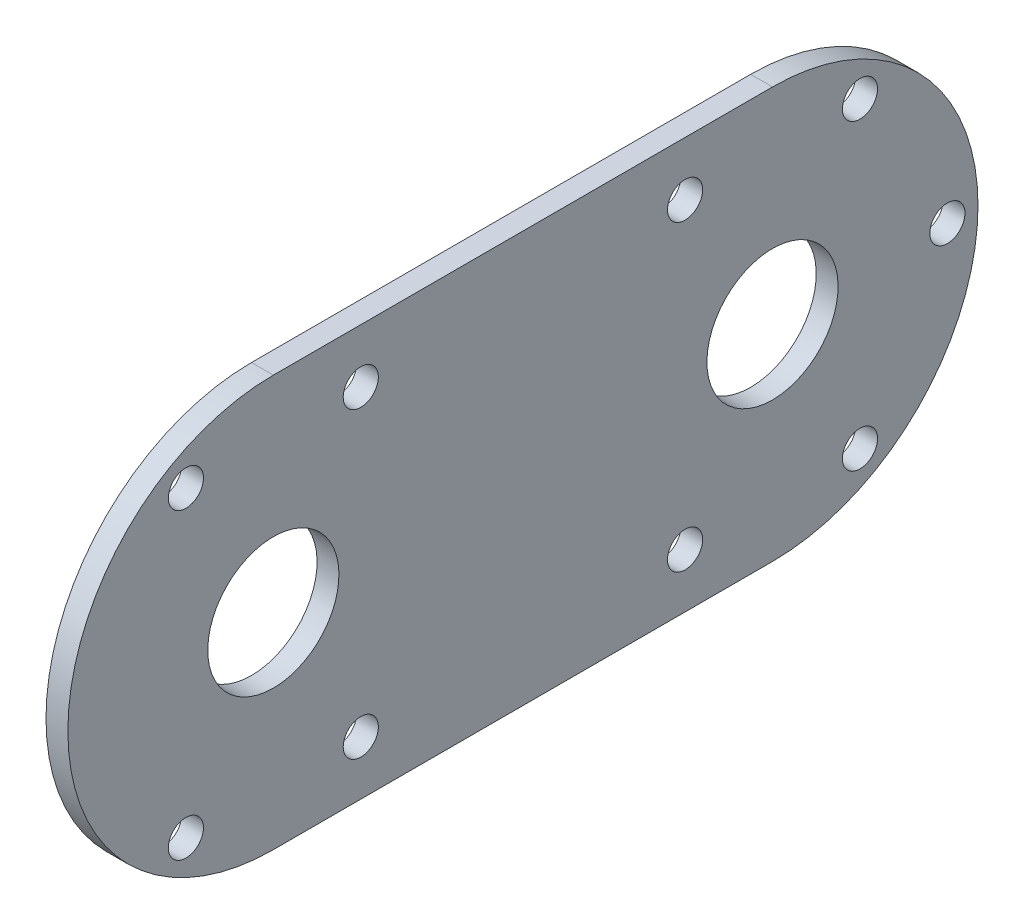
ISO-10303-21;
HEADER;
FILE_DESCRIPTION(('STEP AP214'),'2;1');
FILE_NAME('part.step','',(''),(''),'','','');
FILE_SCHEMA(('AUTOMOTIVE_DESIGN { 1 0 10303 214 1 1 1 1 }'));
ENDSEC;
DATA;
#1=APPLICATION_CONTEXT('core data for automotive mechanical design processes');
#2=APPLICATION_PROTOCOL_DEFINITION('international standard','automotive_design',2000,#1);
#3=PRODUCT_CONTEXT('',#1,'mechanical');
#4=PRODUCT('Part','Part','',(#3));
#5=PRODUCT_RELATED_PRODUCT_CATEGORY('part','',(#4));
#6=PRODUCT_DEFINITION_FORMATION('','',#4);
#7=PRODUCT_DEFINITION_CONTEXT('part definition',#1,'design');
#8=PRODUCT_DEFINITION('design','',#6,#7);
#9=PRODUCT_DEFINITION_SHAPE('','',#8);
#10=(LENGTH_UNIT() NAMED_UNIT(*) SI_UNIT(.MILLI.,.METRE.));
#11=(NAMED_UNIT(*) PLANE_ANGLE_UNIT() SI_UNIT($,.RADIAN.));
#12=(NAMED_UNIT(*) SI_UNIT($,.STERADIAN.) SOLID_ANGLE_UNIT());
#13=UNCERTAINTY_MEASURE_WITH_UNIT(LENGTH_MEASURE(1.E-05),#10,'distance_accuracy_value','');
#14=(GEOMETRIC_REPRESENTATION_CONTEXT(3) GLOBAL_UNCERTAINTY_ASSIGNED_CONTEXT((#13)) GLOBAL_UNIT_ASSIGNED_CONTEXT((#10,
#11,#12)) REPRESENTATION_CONTEXT('',''));
#15=CARTESIAN_POINT('',(0.,0.,0.));
#16=DIRECTION('',(0.,0.,1.));
#17=DIRECTION('',(1.,0.,0.));
#18=AXIS2_PLACEMENT_3D('',#15,#16,#17);
#19=CARTESIAN_POINT('',(282.575,301.6885,330.465339333629));
#20=DIRECTION('',(1.,0.,0.));
#21=DIRECTION('',(0.,1.,0.));
#22=AXIS2_PLACEMENT_3D('',#19,#20,#21);
#23=CYLINDRICAL_SURFACE('',#22,29.845);
#24=CARTESIAN_POINT('',(285.75,301.6885,330.465339333629));
#25=DIRECTION('',(-1.,0.,0.));
#26=DIRECTION('',(0.,-1.,0.));
#27=AXIS2_PLACEMENT_3D('',#24,#25,#26);
#28=CIRCLE('',#27,29.845);
#29=CARTESIAN_POINT('',(285.75,331.5335,330.465339333629));
#30=VERTEX_POINT('',#29);
#31=CARTESIAN_POINT('',(285.75,271.8435,330.465339333629));
#32=VERTEX_POINT('',#31);
#33=EDGE_CURVE('E73',#30,#32,#28,.T.);
#34=ORIENTED_EDGE('',*,*,#33,.T.);
#35=DIRECTION('',(1.,0.,0.));
#36=VECTOR('',#35,1.);
#37=CARTESIAN_POINT('',(282.575,271.8435,330.465339333629));
#38=LINE('',#37,#36);
#39=CARTESIAN_POINT('',(282.575,271.8435,330.465339333629));
#40=VERTEX_POINT('',#39);
#41=EDGE_CURVE('E11',#40,#32,#38,.T.);
#42=ORIENTED_EDGE('',*,*,#41,.F.);
#43=CARTESIAN_POINT('',(282.575,301.6885,330.465339333629));
#44=DIRECTION('',(-1.,0.,0.));
#45=DIRECTION('',(0.,-1.,0.));
#46=AXIS2_PLACEMENT_3D('',#43,#44,#45);
#47=CIRCLE('',#46,29.845);
#48=CARTESIAN_POINT('',(282.575,331.5335,330.465339333629));
#49=VERTEX_POINT('',#48);
#50=EDGE_CURVE('E69',#49,#40,#47,.T.);
#51=ORIENTED_EDGE('',*,*,#50,.F.);
#52=DIRECTION('',(1.,0.,0.));
#53=VECTOR('',#52,1.);
#54=CARTESIAN_POINT('',(282.575,331.5335,330.465339333629));
#55=LINE('',#54,#53);
#56=EDGE_CURVE('E35',#49,#30,#55,.T.);
#57=ORIENTED_EDGE('',*,*,#56,.T.);
#58=EDGE_LOOP('',(#34,#42,#51,#57));
#59=FACE_BOUND('',#58,.T.);
#60=ADVANCED_FACE('F17',(#59),#23,.T.);
#61=CARTESIAN_POINT('',(282.575,271.8435,366.715339333629));
#62=DIRECTION('',(0.,1.,0.));
#63=DIRECTION('',(0.,0.,1.));
#64=AXIS2_PLACEMENT_3D('',#61,#62,#63);
#65=PLANE('',#64);
#66=DIRECTION('',(0.,0.,1.));
#67=VECTOR('',#66,1.);
#68=CARTESIAN_POINT('',(285.75,271.8435,366.715339333629));
#69=LINE('',#68,#67);
#70=CARTESIAN_POINT('',(285.75,271.8435,402.965339333629));
#71=VERTEX_POINT('',#70);
#72=EDGE_CURVE('E76',#32,#71,#69,.T.);
#73=ORIENTED_EDGE('',*,*,#72,.T.);
#74=DIRECTION('',(1.,0.,0.));
#75=VECTOR('',#74,1.);
#76=CARTESIAN_POINT('',(282.575,271.8435,402.965339333629));
#77=LINE('',#76,#75);
#78=CARTESIAN_POINT('',(282.575,271.8435,402.965339333629));
#79=VERTEX_POINT('',#78);
#80=EDGE_CURVE('E27',#79,#71,#77,.T.);
#81=ORIENTED_EDGE('',*,*,#80,.F.);
#82=DIRECTION('',(0.,0.,1.));
#83=VECTOR('',#82,1.);
#84=CARTESIAN_POINT('',(282.575,271.8435,366.715339333629));
#85=LINE('',#84,#83);
#86=EDGE_CURVE('E61',#40,#79,#85,.T.);
#87=ORIENTED_EDGE('',*,*,#86,.F.);
#88=ORIENTED_EDGE('',*,*,#41,.T.);
#89=EDGE_LOOP('',(#73,#81,#87,#88));
#90=FACE_BOUND('',#89,.T.);
#91=ADVANCED_FACE('F19',(#90),#65,.F.);
#92=CARTESIAN_POINT('',(282.575,301.6885,402.965339333629));
#93=DIRECTION('',(1.,0.,0.));
#94=DIRECTION('',(0.,1.,0.));
#95=AXIS2_PLACEMENT_3D('',#92,#93,#94);
#96=CYLINDRICAL_SURFACE('',#95,29.845);
#97=CARTESIAN_POINT('',(285.75,301.6885,402.965339333629));
#98=DIRECTION('',(-1.,0.,0.));
#99=DIRECTION('',(0.,-1.,0.));
#100=AXIS2_PLACEMENT_3D('',#97,#98,#99);
#101=CIRCLE('',#100,29.845);
#102=CARTESIAN_POINT('',(285.75,331.5335,402.965339333629));
#103=VERTEX_POINT('',#102);
#104=EDGE_CURVE('E146',#71,#103,#101,.T.);
#105=ORIENTED_EDGE('',*,*,#104,.T.);
#106=DIRECTION('',(1.,0.,0.));
#107=VECTOR('',#106,1.);
#108=CARTESIAN_POINT('',(282.575,331.5335,402.965339333629));
#109=LINE('',#108,#107);
#110=CARTESIAN_POINT('',(282.575,331.5335,402.965339333629));
#111=VERTEX_POINT('',#110);
#112=EDGE_CURVE('E50',#111,#103,#109,.T.);
#113=ORIENTED_EDGE('',*,*,#112,.F.);
#114=CARTESIAN_POINT('',(282.575,301.6885,402.965339333629));
#115=DIRECTION('',(-1.,0.,0.));
#116=DIRECTION('',(0.,-1.,0.));
#117=AXIS2_PLACEMENT_3D('',#114,#115,#116);
#118=CIRCLE('',#117,29.845);
#119=EDGE_CURVE('E68',#79,#111,#118,.T.);
#120=ORIENTED_EDGE('',*,*,#119,.F.);
#121=ORIENTED_EDGE('',*,*,#80,.T.);
#122=EDGE_LOOP('',(#105,#113,#120,#121));
#123=FACE_BOUND('',#122,.T.);
#124=ADVANCED_FACE('F80',(#123),#96,.T.);
#125=CARTESIAN_POINT('',(282.575,323.685545256125,415.665339333629));
#126=DIRECTION('',(1.,0.,0.));
#127=DIRECTION('',(0.,1.,0.));
#128=AXIS2_PLACEMENT_3D('',#125,#126,#127);
#129=CYLINDRICAL_SURFACE('',#128,2.5527);
#130=CARTESIAN_POINT('',(282.575,323.685545256125,415.665339333629));
#131=DIRECTION('',(-1.,0.,0.));
#132=DIRECTION('',(0.,-1.,0.));
#133=AXIS2_PLACEMENT_3D('',#130,#131,#132);
#134=CIRCLE('',#133,2.5527);
#135=CARTESIAN_POINT('',(282.575,321.132845256124,415.665339333629));
#136=VERTEX_POINT('',#135);
#137=EDGE_CURVE('E94',#136,#136,#134,.T.);
#138=ORIENTED_EDGE('',*,*,#137,.T.);
#139=EDGE_LOOP('',(#138));
#140=FACE_BOUND('',#139,.T.);
#141=CARTESIAN_POINT('',(285.75,323.685545256125,415.665339333629));
#142=DIRECTION('',(-1.,0.,0.));
#143=DIRECTION('',(0.,-1.,0.));
#144=AXIS2_PLACEMENT_3D('',#141,#142,#143);
#145=CIRCLE('',#144,2.5527);
#146=CARTESIAN_POINT('',(285.75,321.132845256124,415.665339333629));
#147=VERTEX_POINT('',#146);
#148=EDGE_CURVE('E138',#147,#147,#145,.T.);
#149=ORIENTED_EDGE('',*,*,#148,.F.);
#150=EDGE_LOOP('',(#149));
#151=FACE_BOUND('',#150,.T.);
#152=ADVANCED_FACE('F247',(#140,#151),#129,.F.);
#153=CARTESIAN_POINT('',(282.575,279.691454743875,390.265339333629));
#154=DIRECTION('',(1.,0.,0.));
#155=DIRECTION('',(0.,1.,0.));
#156=AXIS2_PLACEMENT_3D('',#153,#154,#155);
#157=CYLINDRICAL_SURFACE('',#156,2.5527);
#158=CARTESIAN_POINT('',(282.575,279.691454743875,390.265339333629));
#159=DIRECTION('',(-1.,0.,0.));
#160=DIRECTION('',(0.,-1.,0.));
#161=AXIS2_PLACEMENT_3D('',#158,#159,#160);
#162=CIRCLE('',#161,2.5527);
#163=CARTESIAN_POINT('',(282.575,277.138754743875,390.265339333629));
#164=VERTEX_POINT('',#163);
#165=EDGE_CURVE('E174',#164,#164,#162,.T.);
#166=ORIENTED_EDGE('',*,*,#165,.T.);
#167=EDGE_LOOP('',(#166));
#168=FACE_BOUND('',#167,.T.);
#169=CARTESIAN_POINT('',(285.75,279.691454743875,390.265339333629));
#170=DIRECTION('',(-1.,0.,0.));
#171=DIRECTION('',(0.,-1.,0.));
#172=AXIS2_PLACEMENT_3D('',#169,#170,#171);
#173=CIRCLE('',#172,2.5527);
#174=CARTESIAN_POINT('',(285.75,277.138754743875,390.265339333629));
#175=VERTEX_POINT('',#174);
#176=EDGE_CURVE('E134',#175,#175,#173,.T.);
#177=ORIENTED_EDGE('',*,*,#176,.F.);
#178=EDGE_LOOP('',(#177));
#179=FACE_BOUND('',#178,.T.);
#180=ADVANCED_FACE('F195',(#168,#179),#157,.F.);
#181=CARTESIAN_POINT('',(282.575,279.691454743875,415.665339333629));
#182=DIRECTION('',(1.,0.,0.));
#183=DIRECTION('',(0.,1.,0.));
#184=AXIS2_PLACEMENT_3D('',#181,#182,#183);
#185=CYLINDRICAL_SURFACE('',#184,2.5527);
#186=CARTESIAN_POINT('',(282.575,279.691454743875,415.665339333629));
#187=DIRECTION('',(-1.,0.,0.));
#188=DIRECTION('',(0.,-1.,0.));
#189=AXIS2_PLACEMENT_3D('',#186,#187,#188);
#190=CIRCLE('',#189,2.5527);
#191=CARTESIAN_POINT('',(282.575,277.138754743875,415.665339333629));
#192=VERTEX_POINT('',#191);
#193=EDGE_CURVE('E181',#192,#192,#190,.T.);
#194=ORIENTED_EDGE('',*,*,#193,.T.);
#195=EDGE_LOOP('',(#194));
#196=FACE_BOUND('',#195,.T.);
#197=CARTESIAN_POINT('',(285.75,279.691454743875,415.665339333629));
#198=DIRECTION('',(-1.,0.,0.));
#199=DIRECTION('',(0.,-1.,0.));
#200=AXIS2_PLACEMENT_3D('',#197,#198,#199);
#201=CIRCLE('',#200,2.5527);
#202=CARTESIAN_POINT('',(285.75,277.138754743875,415.665339333629));
#203=VERTEX_POINT('',#202);
#204=EDGE_CURVE('E130',#203,#203,#201,.T.);
#205=ORIENTED_EDGE('',*,*,#204,.F.);
#206=EDGE_LOOP('',(#205));
#207=FACE_BOUND('',#206,.T.);
#208=ADVANCED_FACE('F254',(#196,#207),#185,.F.);
#209=CARTESIAN_POINT('',(282.575,301.6885,402.965339333629));
#210=DIRECTION('',(1.,0.,0.));
#211=DIRECTION('',(0.,1.,0.));
#212=AXIS2_PLACEMENT_3D('',#209,#210,#211);
#213=CYLINDRICAL_SURFACE('',#212,9.525);
#214=CARTESIAN_POINT('',(282.575,301.6885,402.965339333629));
#215=DIRECTION('',(-1.,0.,0.));
#216=DIRECTION('',(0.,-1.,0.));
#217=AXIS2_PLACEMENT_3D('',#214,#215,#216);
#218=CIRCLE('',#217,9.525);
#219=CARTESIAN_POINT('',(282.575,292.1635,402.965339333629));
#220=VERTEX_POINT('',#219);
#221=EDGE_CURVE('E178',#220,#220,#218,.T.);
#222=ORIENTED_EDGE('',*,*,#221,.T.);
#223=EDGE_LOOP('',(#222));
#224=FACE_BOUND('',#223,.T.);
#225=CARTESIAN_POINT('',(285.75,301.6885,402.965339333629));
#226=DIRECTION('',(-1.,0.,0.));
#227=DIRECTION('',(0.,-1.,0.));
#228=AXIS2_PLACEMENT_3D('',#225,#226,#227);
#229=CIRCLE('',#228,9.525);
#230=CARTESIAN_POINT('',(285.75,292.1635,402.965339333629));
#231=VERTEX_POINT('',#230);
#232=EDGE_CURVE('E126',#231,#231,#229,.T.);
#233=ORIENTED_EDGE('',*,*,#232,.F.);
#234=EDGE_LOOP('',(#233));
#235=FACE_BOUND('',#234,.T.);
#236=ADVANCED_FACE('F228',(#224,#235),#213,.F.);
#237=CARTESIAN_POINT('',(282.575,301.6885,305.065339333629));
#238=DIRECTION('',(1.,0.,0.));
#239=DIRECTION('',(0.,1.,0.));
#240=AXIS2_PLACEMENT_3D('',#237,#238,#239);
#241=CYLINDRICAL_SURFACE('',#240,2.5527);
#242=CARTESIAN_POINT('',(282.575,301.6885,305.065339333629));
#243=DIRECTION('',(-1.,0.,0.));
#244=DIRECTION('',(0.,-1.,0.));
#245=AXIS2_PLACEMENT_3D('',#242,#243,#244);
#246=CIRCLE('',#245,2.5527);
#247=CARTESIAN_POINT('',(282.575,299.1358,305.065339333629));
#248=VERTEX_POINT('',#247);
#249=EDGE_CURVE('E109',#248,#248,#246,.F.);
#250=ORIENTED_EDGE('',*,*,#249,.F.);
#251=EDGE_LOOP('',(#250));
#252=FACE_BOUND('',#251,.T.);
#253=CARTESIAN_POINT('',(285.75,301.6885,305.065339333629));
#254=DIRECTION('',(-1.,0.,0.));
#255=DIRECTION('',(0.,-1.,0.));
#256=AXIS2_PLACEMENT_3D('',#253,#254,#255);
#257=CIRCLE('',#256,2.5527);
#258=CARTESIAN_POINT('',(285.75,299.1358,305.065339333629));
#259=VERTEX_POINT('',#258);
#260=EDGE_CURVE('E115',#259,#259,#257,.F.);
#261=ORIENTED_EDGE('',*,*,#260,.T.);
#262=EDGE_LOOP('',(#261));
#263=FACE_BOUND('',#262,.T.);
#264=ADVANCED_FACE('F224',(#252,#263),#241,.F.);
#265=CARTESIAN_POINT('',(282.575,323.685545256125,317.765339333629));
#266=DIRECTION('',(1.,0.,0.));
#267=DIRECTION('',(0.,1.,0.));
#268=AXIS2_PLACEMENT_3D('',#265,#266,#267);
#269=CYLINDRICAL_SURFACE('',#268,2.5527);
#270=CARTESIAN_POINT('',(282.575,323.685545256125,317.765339333629));
#271=DIRECTION('',(-1.,0.,0.));
#272=DIRECTION('',(0.,-1.,0.));
#273=AXIS2_PLACEMENT_3D('',#270,#271,#272);
#274=CIRCLE('',#273,2.5527);
#275=CARTESIAN_POINT('',(282.575,321.132845256124,317.765339333629));
#276=VERTEX_POINT('',#275);
#277=EDGE_CURVE('E105',#276,#276,#274,.F.);
#278=ORIENTED_EDGE('',*,*,#277,.F.);
#279=EDGE_LOOP('',(#278));
#280=FACE_BOUND('',#279,.T.);
#281=CARTESIAN_POINT('',(285.75,323.685545256125,317.765339333629));
#282=DIRECTION('',(-1.,0.,0.));
#283=DIRECTION('',(0.,-1.,0.));
#284=AXIS2_PLACEMENT_3D('',#281,#282,#283);
#285=CIRCLE('',#284,2.5527);
#286=CARTESIAN_POINT('',(285.75,321.132845256124,317.765339333629));
#287=VERTEX_POINT('',#286);
#288=EDGE_CURVE('E160',#287,#287,#285,.F.);
#289=ORIENTED_EDGE('',*,*,#288,.T.);
#290=EDGE_LOOP('',(#289));
#291=FACE_BOUND('',#290,.T.);
#292=ADVANCED_FACE('F227',(#280,#291),#269,.F.);
#293=CARTESIAN_POINT('',(282.575,279.691454743875,343.165339333629));
#294=DIRECTION('',(1.,0.,0.));
#295=DIRECTION('',(0.,1.,0.));
#296=AXIS2_PLACEMENT_3D('',#293,#294,#295);
#297=CYLINDRICAL_SURFACE('',#296,2.5527);
#298=CARTESIAN_POINT('',(282.575,279.691454743875,343.165339333629));
#299=DIRECTION('',(-1.,0.,0.));
#300=DIRECTION('',(0.,-1.,0.));
#301=AXIS2_PLACEMENT_3D('',#298,#299,#300);
#302=CIRCLE('',#301,2.5527);
#303=CARTESIAN_POINT('',(282.575,277.138754743875,343.165339333629));
#304=VERTEX_POINT('',#303);
#305=EDGE_CURVE('E101',#304,#304,#302,.F.);
#306=ORIENTED_EDGE('',*,*,#305,.F.);
#307=EDGE_LOOP('',(#306));
#308=FACE_BOUND('',#307,.T.);
#309=CARTESIAN_POINT('',(285.75,279.691454743875,343.165339333629));
#310=DIRECTION('',(-1.,0.,0.));
#311=DIRECTION('',(0.,-1.,0.));
#312=AXIS2_PLACEMENT_3D('',#309,#310,#311);
#313=CIRCLE('',#312,2.5527);
#314=CARTESIAN_POINT('',(285.75,277.138754743875,343.165339333629));
#315=VERTEX_POINT('',#314);
#316=EDGE_CURVE('E156',#315,#315,#313,.F.);
#317=ORIENTED_EDGE('',*,*,#316,.T.);
#318=EDGE_LOOP('',(#317));
#319=FACE_BOUND('',#318,.T.);
#320=ADVANCED_FACE('F232',(#308,#319),#297,.F.);
#321=CARTESIAN_POINT('',(282.575,323.685545256125,343.165339333629));
#322=DIRECTION('',(1.,0.,0.));
#323=DIRECTION('',(0.,1.,0.));
#324=AXIS2_PLACEMENT_3D('',#321,#322,#323);
#325=CYLINDRICAL_SURFACE('',#324,2.5527);
#326=CARTESIAN_POINT('',(282.575,323.685545256125,343.165339333629));
#327=DIRECTION('',(-1.,0.,0.));
#328=DIRECTION('',(0.,-1.,0.));
#329=AXIS2_PLACEMENT_3D('',#326,#327,#328);
#330=CIRCLE('',#329,2.5527);
#331=CARTESIAN_POINT('',(282.575,321.132845256124,343.165339333629));
#332=VERTEX_POINT('',#331);
#333=EDGE_CURVE('E90',#332,#332,#330,.F.);
#334=ORIENTED_EDGE('',*,*,#333,.F.);
#335=EDGE_LOOP('',(#334));
#336=FACE_BOUND('',#335,.T.);
#337=CARTESIAN_POINT('',(285.75,323.685545256125,343.165339333629));
#338=DIRECTION('',(-1.,0.,0.));
#339=DIRECTION('',(0.,-1.,0.));
#340=AXIS2_PLACEMENT_3D('',#337,#338,#339);
#341=CIRCLE('',#340,2.5527);
#342=CARTESIAN_POINT('',(285.75,321.132845256124,343.165339333629));
#343=VERTEX_POINT('',#342);
#344=EDGE_CURVE('E153',#343,#343,#341,.F.);
#345=ORIENTED_EDGE('',*,*,#344,.T.);
#346=EDGE_LOOP('',(#345));
#347=FACE_BOUND('',#346,.T.);
#348=ADVANCED_FACE('F236',(#336,#347),#325,.F.);
#349=CARTESIAN_POINT('',(282.575,279.691454743875,317.765339333629));
#350=DIRECTION('',(1.,0.,0.));
#351=DIRECTION('',(0.,1.,0.));
#352=AXIS2_PLACEMENT_3D('',#349,#350,#351);
#353=CYLINDRICAL_SURFACE('',#352,2.5527);
#354=CARTESIAN_POINT('',(282.575,279.691454743875,317.765339333629));
#355=DIRECTION('',(-1.,0.,0.));
#356=DIRECTION('',(0.,-1.,0.));
#357=AXIS2_PLACEMENT_3D('',#354,#355,#356);
#358=CIRCLE('',#357,2.5527);
#359=CARTESIAN_POINT('',(282.575,277.138754743875,317.765339333629));
#360=VERTEX_POINT('',#359);
#361=EDGE_CURVE('E82',#360,#360,#358,.F.);
#362=ORIENTED_EDGE('',*,*,#361,.F.);
#363=EDGE_LOOP('',(#362));
#364=FACE_BOUND('',#363,.T.);
#365=CARTESIAN_POINT('',(285.75,279.691454743875,317.765339333629));
#366=DIRECTION('',(-1.,0.,0.));
#367=DIRECTION('',(0.,-1.,0.));
#368=AXIS2_PLACEMENT_3D('',#365,#366,#367);
#369=CIRCLE('',#368,2.5527);
#370=CARTESIAN_POINT('',(285.75,277.138754743875,317.765339333629));
#371=VERTEX_POINT('',#370);
#372=EDGE_CURVE('E149',#371,#371,#369,.F.);
#373=ORIENTED_EDGE('',*,*,#372,.T.);
#374=EDGE_LOOP('',(#373));
#375=FACE_BOUND('',#374,.T.);
#376=ADVANCED_FACE('F240',(#364,#375),#353,.F.);
#377=CARTESIAN_POINT('',(282.575,301.6885,330.465339333629));
#378=DIRECTION('',(1.,0.,0.));
#379=DIRECTION('',(0.,1.,0.));
#380=AXIS2_PLACEMENT_3D('',#377,#378,#379);
#381=CYLINDRICAL_SURFACE('',#380,9.525);
#382=CARTESIAN_POINT('',(282.575,301.6885,330.465339333629));
#383=DIRECTION('',(-1.,0.,0.));
#384=DIRECTION('',(0.,-1.,0.));
#385=AXIS2_PLACEMENT_3D('',#382,#383,#384);
#386=CIRCLE('',#385,9.525);
#387=CARTESIAN_POINT('',(282.575,292.1635,330.465339333629));
#388=VERTEX_POINT('',#387);
#389=EDGE_CURVE('E176',#388,#388,#386,.T.);
#390=ORIENTED_EDGE('',*,*,#389,.T.);
#391=EDGE_LOOP('',(#390));
#392=FACE_BOUND('',#391,.T.);
#393=CARTESIAN_POINT('',(285.75,301.6885,330.465339333629));
#394=DIRECTION('',(-1.,0.,0.));
#395=DIRECTION('',(0.,-1.,0.));
#396=AXIS2_PLACEMENT_3D('',#393,#394,#395);
#397=CIRCLE('',#396,9.525);
#398=CARTESIAN_POINT('',(285.75,292.1635,330.465339333629));
#399=VERTEX_POINT('',#398);
#400=EDGE_CURVE('E122',#399,#399,#397,.T.);
#401=ORIENTED_EDGE('',*,*,#400,.F.);
#402=EDGE_LOOP('',(#401));
#403=FACE_BOUND('',#402,.T.);
#404=ADVANCED_FACE('F244',(#392,#403),#381,.F.);
#405=CARTESIAN_POINT('',(282.575,331.5335,366.715339333629));
#406=DIRECTION('',(0.,1.,0.));
#407=DIRECTION('',(-1.,0.,0.));
#408=AXIS2_PLACEMENT_3D('',#405,#406,#407);
#409=PLANE('',#408);
#410=DIRECTION('',(0.,0.,1.));
#411=VECTOR('',#410,1.);
#412=CARTESIAN_POINT('',(285.75,331.5335,366.715339333629));
#413=LINE('',#412,#411);
#414=EDGE_CURVE('E118',#30,#103,#413,.T.);
#415=ORIENTED_EDGE('',*,*,#414,.F.);
#416=ORIENTED_EDGE('',*,*,#56,.F.);
#417=DIRECTION('',(0.,0.,1.));
#418=VECTOR('',#417,1.);
#419=CARTESIAN_POINT('',(282.575,331.5335,366.715339333629));
#420=LINE('',#419,#418);
#421=EDGE_CURVE('E72',#49,#111,#420,.T.);
#422=ORIENTED_EDGE('',*,*,#421,.T.);
#423=ORIENTED_EDGE('',*,*,#112,.T.);
#424=EDGE_LOOP('',(#415,#416,#422,#423));
#425=FACE_BOUND('',#424,.T.);
#426=ADVANCED_FACE('F209',(#425),#409,.T.);
#427=CARTESIAN_POINT('',(282.575,323.685545256125,390.265339333629));
#428=DIRECTION('',(1.,0.,0.));
#429=DIRECTION('',(0.,1.,0.));
#430=AXIS2_PLACEMENT_3D('',#427,#428,#429);
#431=CYLINDRICAL_SURFACE('',#430,2.5527);
#432=CARTESIAN_POINT('',(282.575,323.685545256125,390.265339333629));
#433=DIRECTION('',(-1.,0.,0.));
#434=DIRECTION('',(0.,-1.,0.));
#435=AXIS2_PLACEMENT_3D('',#432,#433,#434);
#436=CIRCLE('',#435,2.5527);
#437=CARTESIAN_POINT('',(282.575,321.132845256124,390.265339333629));
#438=VERTEX_POINT('',#437);
#439=EDGE_CURVE('E83',#438,#438,#436,.T.);
#440=ORIENTED_EDGE('',*,*,#439,.T.);
#441=EDGE_LOOP('',(#440));
#442=FACE_BOUND('',#441,.T.);
#443=CARTESIAN_POINT('',(285.75,323.685545256125,390.265339333629));
#444=DIRECTION('',(-1.,0.,0.));
#445=DIRECTION('',(0.,-1.,0.));
#446=AXIS2_PLACEMENT_3D('',#443,#444,#445);
#447=CIRCLE('',#446,2.5527);
#448=CARTESIAN_POINT('',(285.75,321.132845256124,390.265339333629));
#449=VERTEX_POINT('',#448);
#450=EDGE_CURVE('E142',#449,#449,#447,.T.);
#451=ORIENTED_EDGE('',*,*,#450,.F.);
#452=EDGE_LOOP('',(#451));
#453=FACE_BOUND('',#452,.T.);
#454=ADVANCED_FACE('F201',(#442,#453),#431,.F.);
#455=CARTESIAN_POINT('',(282.575,301.6885,366.715339333629));
#456=DIRECTION('',(-1.,0.,0.));
#457=DIRECTION('',(0.,-1.,0.));
#458=AXIS2_PLACEMENT_3D('',#455,#456,#457);
#459=PLANE('',#458);
#460=ORIENTED_EDGE('',*,*,#50,.T.);
#461=ORIENTED_EDGE('',*,*,#86,.T.);
#462=ORIENTED_EDGE('',*,*,#119,.T.);
#463=ORIENTED_EDGE('',*,*,#421,.F.);
#464=EDGE_LOOP('',(#460,#461,#462,#463));
#465=FACE_BOUND('',#464,.T.);
#466=ORIENTED_EDGE('',*,*,#389,.F.);
#467=EDGE_LOOP('',(#466));
#468=FACE_BOUND('',#467,.T.);
#469=ORIENTED_EDGE('',*,*,#361,.T.);
#470=EDGE_LOOP('',(#469));
#471=FACE_BOUND('',#470,.T.);
#472=ORIENTED_EDGE('',*,*,#333,.T.);
#473=EDGE_LOOP('',(#472));
#474=FACE_BOUND('',#473,.T.);
#475=ORIENTED_EDGE('',*,*,#305,.T.);
#476=EDGE_LOOP('',(#475));
#477=FACE_BOUND('',#476,.T.);
#478=ORIENTED_EDGE('',*,*,#277,.T.);
#479=EDGE_LOOP('',(#478));
#480=FACE_BOUND('',#479,.T.);
#481=ORIENTED_EDGE('',*,*,#249,.T.);
#482=EDGE_LOOP('',(#481));
#483=FACE_BOUND('',#482,.T.);
#484=ORIENTED_EDGE('',*,*,#221,.F.);
#485=EDGE_LOOP('',(#484));
#486=FACE_BOUND('',#485,.T.);
#487=ORIENTED_EDGE('',*,*,#193,.F.);
#488=EDGE_LOOP('',(#487));
#489=FACE_BOUND('',#488,.T.);
#490=ORIENTED_EDGE('',*,*,#165,.F.);
#491=EDGE_LOOP('',(#490));
#492=FACE_BOUND('',#491,.T.);
#493=ORIENTED_EDGE('',*,*,#137,.F.);
#494=EDGE_LOOP('',(#493));
#495=FACE_BOUND('',#494,.T.);
#496=ORIENTED_EDGE('',*,*,#439,.F.);
#497=EDGE_LOOP('',(#496));
#498=FACE_BOUND('',#497,.T.);
#499=ADVANCED_FACE('F64',(#465,#468,#471,#474,#477,#480,#483,#486,#489,#492,#495,#498),#459,.T.);
#500=CARTESIAN_POINT('',(285.75,301.6885,366.715339333629));
#501=DIRECTION('',(-1.,0.,0.));
#502=DIRECTION('',(0.,-1.,0.));
#503=AXIS2_PLACEMENT_3D('',#500,#501,#502);
#504=PLANE('',#503);
#505=ORIENTED_EDGE('',*,*,#33,.F.);
#506=ORIENTED_EDGE('',*,*,#414,.T.);
#507=ORIENTED_EDGE('',*,*,#104,.F.);
#508=ORIENTED_EDGE('',*,*,#72,.F.);
#509=EDGE_LOOP('',(#505,#506,#507,#508));
#510=FACE_BOUND('',#509,.T.);
#511=ORIENTED_EDGE('',*,*,#400,.T.);
#512=EDGE_LOOP('',(#511));
#513=FACE_BOUND('',#512,.T.);
#514=ORIENTED_EDGE('',*,*,#372,.F.);
#515=EDGE_LOOP('',(#514));
#516=FACE_BOUND('',#515,.T.);
#517=ORIENTED_EDGE('',*,*,#344,.F.);
#518=EDGE_LOOP('',(#517));
#519=FACE_BOUND('',#518,.T.);
#520=ORIENTED_EDGE('',*,*,#316,.F.);
#521=EDGE_LOOP('',(#520));
#522=FACE_BOUND('',#521,.T.);
#523=ORIENTED_EDGE('',*,*,#288,.F.);
#524=EDGE_LOOP('',(#523));
#525=FACE_BOUND('',#524,.T.);
#526=ORIENTED_EDGE('',*,*,#260,.F.);
#527=EDGE_LOOP('',(#526));
#528=FACE_BOUND('',#527,.T.);
#529=ORIENTED_EDGE('',*,*,#232,.T.);
#530=EDGE_LOOP('',(#529));
#531=FACE_BOUND('',#530,.T.);
#532=ORIENTED_EDGE('',*,*,#204,.T.);
#533=EDGE_LOOP('',(#532));
#534=FACE_BOUND('',#533,.T.);
#535=ORIENTED_EDGE('',*,*,#176,.T.);
#536=EDGE_LOOP('',(#535));
#537=FACE_BOUND('',#536,.T.);
#538=ORIENTED_EDGE('',*,*,#148,.T.);
#539=EDGE_LOOP('',(#538));
#540=FACE_BOUND('',#539,.T.);
#541=ORIENTED_EDGE('',*,*,#450,.T.);
#542=EDGE_LOOP('',(#541));
#543=FACE_BOUND('',#542,.T.);
#544=ADVANCED_FACE('F200',(#510,#513,#516,#519,#522,#525,#528,#531,#534,#537,#540,#543),#504,.F.);
#545=CLOSED_SHELL('',(#60,#91,#124,#152,#180,#208,#236,#264,#292,#320,#348,#376,#404,#426,#454,
#499,#544));
#546=MANIFOLD_SOLID_BREP('B1',#545);
#547=ADVANCED_BREP_SHAPE_REPRESENTATION('',(#18,#546),#14);
#548=SHAPE_DEFINITION_REPRESENTATION(#9,#547);
ENDSEC;
END-ISO-10303-21;
